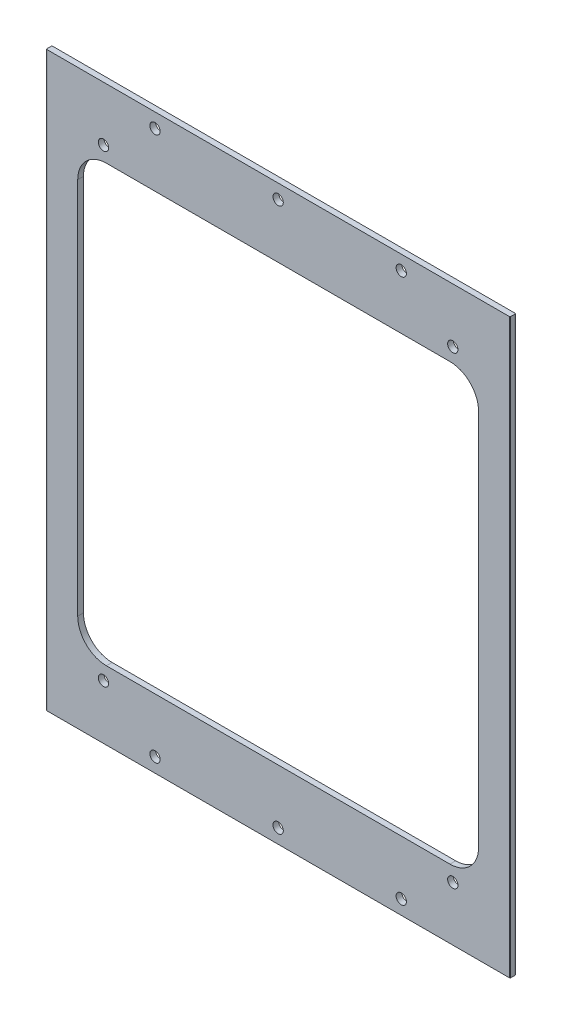
ISO-10303-21;
HEADER;
FILE_DESCRIPTION(('STEP AP214'),'2;1');
FILE_NAME('part.step','',(''),(''),'','','');
FILE_SCHEMA(('AUTOMOTIVE_DESIGN { 1 0 10303 214 1 1 1 1 }'));
ENDSEC;
DATA;
#1=APPLICATION_CONTEXT('core data for automotive mechanical design processes');
#2=APPLICATION_PROTOCOL_DEFINITION('international standard','automotive_design',2000,#1);
#3=PRODUCT_CONTEXT('',#1,'mechanical');
#4=PRODUCT('Part','Part','',(#3));
#5=PRODUCT_RELATED_PRODUCT_CATEGORY('part','',(#4));
#6=PRODUCT_DEFINITION_FORMATION('','',#4);
#7=PRODUCT_DEFINITION_CONTEXT('part definition',#1,'design');
#8=PRODUCT_DEFINITION('design','',#6,#7);
#9=PRODUCT_DEFINITION_SHAPE('','',#8);
#10=(LENGTH_UNIT() NAMED_UNIT(*) SI_UNIT(.MILLI.,.METRE.));
#11=(NAMED_UNIT(*) PLANE_ANGLE_UNIT() SI_UNIT($,.RADIAN.));
#12=(NAMED_UNIT(*) SI_UNIT($,.STERADIAN.) SOLID_ANGLE_UNIT());
#13=UNCERTAINTY_MEASURE_WITH_UNIT(LENGTH_MEASURE(1.E-05),#10,'distance_accuracy_value','');
#14=(GEOMETRIC_REPRESENTATION_CONTEXT(3) GLOBAL_UNCERTAINTY_ASSIGNED_CONTEXT((#13)) GLOBAL_UNIT_ASSIGNED_CONTEXT((#10,
#11,#12)) REPRESENTATION_CONTEXT('',''));
#15=CARTESIAN_POINT('',(0.,0.,0.));
#16=DIRECTION('',(0.,0.,1.));
#17=DIRECTION('',(1.,0.,0.));
#18=AXIS2_PLACEMENT_3D('',#15,#16,#17);
#19=CARTESIAN_POINT('',(40.5,-50.,0.5));
#20=DIRECTION('',(-1.,0.,0.));
#21=DIRECTION('',(0.,0.,1.));
#22=AXIS2_PLACEMENT_3D('',#19,#20,#21);
#23=PLANE('',#22);
#24=DIRECTION('',(0.,0.,-1.));
#25=VECTOR('',#24,1.);
#26=CARTESIAN_POINT('',(40.5,-50.,0.5));
#27=LINE('',#26,#25);
#28=CARTESIAN_POINT('',(40.5,-50.,0.4));
#29=VERTEX_POINT('',#28);
#30=CARTESIAN_POINT('',(40.5,-50.,-0.4));
#31=VERTEX_POINT('',#30);
#32=EDGE_CURVE('E233',#29,#31,#27,.T.);
#33=ORIENTED_EDGE('',*,*,#32,.T.);
#34=DIRECTION('',(0.,1.,0.));
#35=VECTOR('',#34,1.);
#36=CARTESIAN_POINT('',(40.5,50.,-0.4));
#37=LINE('',#36,#35);
#38=CARTESIAN_POINT('',(40.5,50.,-0.4));
#39=VERTEX_POINT('',#38);
#40=EDGE_CURVE('E288',#31,#39,#37,.T.);
#41=ORIENTED_EDGE('',*,*,#40,.T.);
#42=DIRECTION('',(0.,0.,-1.));
#43=VECTOR('',#42,1.);
#44=CARTESIAN_POINT('',(40.5,50.,0.5));
#45=LINE('',#44,#43);
#46=CARTESIAN_POINT('',(40.5,50.,0.4));
#47=VERTEX_POINT('',#46);
#48=EDGE_CURVE('E245',#47,#39,#45,.T.);
#49=ORIENTED_EDGE('',*,*,#48,.F.);
#50=DIRECTION('',(0.,1.,0.));
#51=VECTOR('',#50,1.);
#52=CARTESIAN_POINT('',(40.5,-50.,0.4));
#53=LINE('',#52,#51);
#54=EDGE_CURVE('E248',#47,#29,#53,.F.);
#55=ORIENTED_EDGE('',*,*,#54,.T.);
#56=EDGE_LOOP('',(#33,#41,#49,#55));
#57=FACE_BOUND('',#56,.T.);
#58=ADVANCED_FACE('F32',(#57),#23,.F.);
#59=CARTESIAN_POINT('',(-40.5,50.,0.5));
#60=DIRECTION('',(0.,-1.,0.));
#61=DIRECTION('',(0.,0.,-1.));
#62=AXIS2_PLACEMENT_3D('',#59,#60,#61);
#63=PLANE('',#62);
#64=ORIENTED_EDGE('',*,*,#48,.T.);
#65=CARTESIAN_POINT('',(40.4,50.,-0.4));
#66=DIRECTION('',(0.,-1.,0.));
#67=DIRECTION('',(0.,0.,-1.));
#68=AXIS2_PLACEMENT_3D('',#65,#66,#67);
#69=CIRCLE('',#68,0.1);
#70=CARTESIAN_POINT('',(40.4,50.,-0.5));
#71=VERTEX_POINT('',#70);
#72=EDGE_CURVE('E297',#39,#71,#69,.F.);
#73=ORIENTED_EDGE('',*,*,#72,.T.);
#74=DIRECTION('',(-1.,0.,0.));
#75=VECTOR('',#74,1.);
#76=CARTESIAN_POINT('',(-40.5,50.,-0.5));
#77=LINE('',#76,#75);
#78=CARTESIAN_POINT('',(-40.4,50.,-0.5));
#79=VERTEX_POINT('',#78);
#80=EDGE_CURVE('E214',#71,#79,#77,.T.);
#81=ORIENTED_EDGE('',*,*,#80,.T.);
#82=CARTESIAN_POINT('',(-40.4,50.,-0.4));
#83=DIRECTION('',(0.,-1.,0.));
#84=DIRECTION('',(0.,0.,-1.));
#85=AXIS2_PLACEMENT_3D('',#82,#83,#84);
#86=CIRCLE('',#85,0.1);
#87=CARTESIAN_POINT('',(-40.5,50.,-0.4));
#88=VERTEX_POINT('',#87);
#89=EDGE_CURVE('E293',#79,#88,#86,.F.);
#90=ORIENTED_EDGE('',*,*,#89,.T.);
#91=DIRECTION('',(0.,0.,-1.));
#92=VECTOR('',#91,1.);
#93=CARTESIAN_POINT('',(-40.5,50.,0.5));
#94=LINE('',#93,#92);
#95=CARTESIAN_POINT('',(-40.5,50.,0.4));
#96=VERTEX_POINT('',#95);
#97=EDGE_CURVE('E242',#96,#88,#94,.T.);
#98=ORIENTED_EDGE('',*,*,#97,.F.);
#99=CARTESIAN_POINT('',(-40.4,50.,0.4));
#100=DIRECTION('',(0.,-1.,0.));
#101=DIRECTION('',(0.,0.,-1.));
#102=AXIS2_PLACEMENT_3D('',#99,#100,#101);
#103=CIRCLE('',#102,0.1);
#104=CARTESIAN_POINT('',(-40.4,50.,0.5));
#105=VERTEX_POINT('',#104);
#106=EDGE_CURVE('E291',#96,#105,#103,.F.);
#107=ORIENTED_EDGE('',*,*,#106,.T.);
#108=DIRECTION('',(-1.,0.,0.));
#109=VECTOR('',#108,1.);
#110=CARTESIAN_POINT('',(-40.5,50.,0.5));
#111=LINE('',#110,#109);
#112=CARTESIAN_POINT('',(40.4,50.,0.5));
#113=VERTEX_POINT('',#112);
#114=EDGE_CURVE('E226',#113,#105,#111,.T.);
#115=ORIENTED_EDGE('',*,*,#114,.F.);
#116=CARTESIAN_POINT('',(40.4,50.,0.4));
#117=DIRECTION('',(0.,-1.,0.));
#118=DIRECTION('',(0.,0.,-1.));
#119=AXIS2_PLACEMENT_3D('',#116,#117,#118);
#120=CIRCLE('',#119,0.1);
#121=EDGE_CURVE('E295',#113,#47,#120,.F.);
#122=ORIENTED_EDGE('',*,*,#121,.T.);
#123=EDGE_LOOP('',(#64,#73,#81,#90,#98,#107,#115,#122));
#124=FACE_BOUND('',#123,.T.);
#125=ADVANCED_FACE('F321',(#124),#63,.F.);
#126=CARTESIAN_POINT('',(-40.5,-50.,0.5));
#127=DIRECTION('',(1.,0.,0.));
#128=DIRECTION('',(0.,0.,-1.));
#129=AXIS2_PLACEMENT_3D('',#126,#127,#128);
#130=PLANE('',#129);
#131=ORIENTED_EDGE('',*,*,#97,.T.);
#132=DIRECTION('',(0.,-1.,0.));
#133=VECTOR('',#132,1.);
#134=CARTESIAN_POINT('',(-40.5,-50.,-0.4));
#135=LINE('',#134,#133);
#136=CARTESIAN_POINT('',(-40.5,-50.,-0.4));
#137=VERTEX_POINT('',#136);
#138=EDGE_CURVE('E11',#88,#137,#135,.T.);
#139=ORIENTED_EDGE('',*,*,#138,.T.);
#140=DIRECTION('',(0.,0.,-1.));
#141=VECTOR('',#140,1.);
#142=CARTESIAN_POINT('',(-40.5,-50.,0.5));
#143=LINE('',#142,#141);
#144=CARTESIAN_POINT('',(-40.5,-50.,0.4));
#145=VERTEX_POINT('',#144);
#146=EDGE_CURVE('E240',#145,#137,#143,.T.);
#147=ORIENTED_EDGE('',*,*,#146,.F.);
#148=DIRECTION('',(0.,-1.,0.));
#149=VECTOR('',#148,1.);
#150=CARTESIAN_POINT('',(-40.5,-50.,0.4));
#151=LINE('',#150,#149);
#152=EDGE_CURVE('E40',#145,#96,#151,.F.);
#153=ORIENTED_EDGE('',*,*,#152,.T.);
#154=EDGE_LOOP('',(#131,#139,#147,#153));
#155=FACE_BOUND('',#154,.T.);
#156=ADVANCED_FACE('F317',(#155),#130,.F.);
#157=CARTESIAN_POINT('',(-40.5,-50.,0.5));
#158=DIRECTION('',(0.,1.,0.));
#159=DIRECTION('',(0.,0.,1.));
#160=AXIS2_PLACEMENT_3D('',#157,#158,#159);
#161=PLANE('',#160);
#162=DIRECTION('',(1.,0.,0.));
#163=VECTOR('',#162,1.);
#164=CARTESIAN_POINT('',(-40.5,-50.,-0.5));
#165=LINE('',#164,#163);
#166=CARTESIAN_POINT('',(-40.4,-50.,-0.5));
#167=VERTEX_POINT('',#166);
#168=CARTESIAN_POINT('',(40.4,-50.,-0.5));
#169=VERTEX_POINT('',#168);
#170=EDGE_CURVE('E230',#167,#169,#165,.T.);
#171=ORIENTED_EDGE('',*,*,#170,.T.);
#172=CARTESIAN_POINT('',(40.4,-50.,-0.4));
#173=DIRECTION('',(0.,1.,0.));
#174=DIRECTION('',(0.,0.,1.));
#175=AXIS2_PLACEMENT_3D('',#172,#173,#174);
#176=CIRCLE('',#175,0.1);
#177=EDGE_CURVE('E307',#169,#31,#176,.F.);
#178=ORIENTED_EDGE('',*,*,#177,.T.);
#179=ORIENTED_EDGE('',*,*,#32,.F.);
#180=CARTESIAN_POINT('',(40.4,-50.,0.4));
#181=DIRECTION('',(0.,1.,0.));
#182=DIRECTION('',(0.,0.,1.));
#183=AXIS2_PLACEMENT_3D('',#180,#181,#182);
#184=CIRCLE('',#183,0.1);
#185=CARTESIAN_POINT('',(40.4,-50.,0.5));
#186=VERTEX_POINT('',#185);
#187=EDGE_CURVE('E305',#29,#186,#184,.F.);
#188=ORIENTED_EDGE('',*,*,#187,.T.);
#189=DIRECTION('',(1.,0.,0.));
#190=VECTOR('',#189,1.);
#191=CARTESIAN_POINT('',(-40.5,-50.,0.5));
#192=LINE('',#191,#190);
#193=CARTESIAN_POINT('',(-40.4,-50.,0.5));
#194=VERTEX_POINT('',#193);
#195=EDGE_CURVE('E229',#194,#186,#192,.T.);
#196=ORIENTED_EDGE('',*,*,#195,.F.);
#197=CARTESIAN_POINT('',(-40.4,-50.,0.4));
#198=DIRECTION('',(0.,1.,0.));
#199=DIRECTION('',(0.,0.,1.));
#200=AXIS2_PLACEMENT_3D('',#197,#198,#199);
#201=CIRCLE('',#200,0.1);
#202=EDGE_CURVE('E54',#194,#145,#201,.F.);
#203=ORIENTED_EDGE('',*,*,#202,.T.);
#204=ORIENTED_EDGE('',*,*,#146,.T.);
#205=CARTESIAN_POINT('',(-40.4,-50.,-0.4));
#206=DIRECTION('',(0.,1.,0.));
#207=DIRECTION('',(0.,0.,1.));
#208=AXIS2_PLACEMENT_3D('',#205,#206,#207);
#209=CIRCLE('',#208,0.1);
#210=EDGE_CURVE('E47',#137,#167,#209,.F.);
#211=ORIENTED_EDGE('',*,*,#210,.T.);
#212=EDGE_LOOP('',(#171,#178,#179,#188,#196,#203,#204,#211));
#213=FACE_BOUND('',#212,.T.);
#214=ADVANCED_FACE('F328',(#213),#161,.F.);
#215=CARTESIAN_POINT('',(0.,0.,0.5));
#216=DIRECTION('',(0.,0.,-1.));
#217=DIRECTION('',(-1.,0.,0.));
#218=AXIS2_PLACEMENT_3D('',#215,#216,#217);
#219=PLANE('',#218);
#220=CARTESIAN_POINT('',(0.,47.5,0.500000000000001));
#221=DIRECTION('',(0.,0.,1.));
#222=DIRECTION('',(1.,0.,0.));
#223=AXIS2_PLACEMENT_3D('',#220,#221,#222);
#224=CIRCLE('',#223,0.899999999999989);
#225=CARTESIAN_POINT('',(0.899999999999989,47.5,0.500000000000001));
#226=VERTEX_POINT('',#225);
#227=EDGE_CURVE('E286',#226,#226,#224,.T.);
#228=ORIENTED_EDGE('',*,*,#227,.F.);
#229=EDGE_LOOP('',(#228));
#230=FACE_BOUND('',#229,.T.);
#231=CARTESIAN_POINT('',(0.,-47.5,0.500000000000001));
#232=DIRECTION('',(0.,0.,1.));
#233=DIRECTION('',(1.,0.,0.));
#234=AXIS2_PLACEMENT_3D('',#231,#232,#233);
#235=CIRCLE('',#234,0.899999999999989);
#236=CARTESIAN_POINT('',(0.899999999999989,-47.5,0.500000000000001));
#237=VERTEX_POINT('',#236);
#238=EDGE_CURVE('E282',#237,#237,#235,.T.);
#239=ORIENTED_EDGE('',*,*,#238,.F.);
#240=EDGE_LOOP('',(#239));
#241=FACE_BOUND('',#240,.T.);
#242=CARTESIAN_POINT('',(-21.5,47.5,0.500000000000001));
#243=DIRECTION('',(0.,0.,1.));
#244=DIRECTION('',(1.,0.,0.));
#245=AXIS2_PLACEMENT_3D('',#242,#243,#244);
#246=CIRCLE('',#245,0.899999999999988);
#247=CARTESIAN_POINT('',(-20.6,47.5,0.500000000000001));
#248=VERTEX_POINT('',#247);
#249=EDGE_CURVE('E278',#248,#248,#246,.T.);
#250=ORIENTED_EDGE('',*,*,#249,.F.);
#251=EDGE_LOOP('',(#250));
#252=FACE_BOUND('',#251,.T.);
#253=CARTESIAN_POINT('',(21.5,47.5,0.500000000000001));
#254=DIRECTION('',(0.,0.,1.));
#255=DIRECTION('',(1.,0.,0.));
#256=AXIS2_PLACEMENT_3D('',#253,#254,#255);
#257=CIRCLE('',#256,0.899999999999988);
#258=CARTESIAN_POINT('',(22.4,47.5,0.500000000000001));
#259=VERTEX_POINT('',#258);
#260=EDGE_CURVE('E274',#259,#259,#257,.T.);
#261=ORIENTED_EDGE('',*,*,#260,.F.);
#262=EDGE_LOOP('',(#261));
#263=FACE_BOUND('',#262,.T.);
#264=CARTESIAN_POINT('',(-21.5,-47.5,0.500000000000001));
#265=DIRECTION('',(0.,0.,1.));
#266=DIRECTION('',(1.,0.,0.));
#267=AXIS2_PLACEMENT_3D('',#264,#265,#266);
#268=CIRCLE('',#267,0.899999999999991);
#269=CARTESIAN_POINT('',(-20.6,-47.5,0.500000000000001));
#270=VERTEX_POINT('',#269);
#271=EDGE_CURVE('E270',#270,#270,#268,.T.);
#272=ORIENTED_EDGE('',*,*,#271,.F.);
#273=EDGE_LOOP('',(#272));
#274=FACE_BOUND('',#273,.T.);
#275=CARTESIAN_POINT('',(21.5,-47.5,0.500000000000001));
#276=DIRECTION('',(0.,0.,1.));
#277=DIRECTION('',(1.,0.,0.));
#278=AXIS2_PLACEMENT_3D('',#275,#276,#277);
#279=CIRCLE('',#278,0.899999999999988);
#280=CARTESIAN_POINT('',(22.4,-47.5,0.500000000000001));
#281=VERTEX_POINT('',#280);
#282=EDGE_CURVE('E266',#281,#281,#279,.T.);
#283=ORIENTED_EDGE('',*,*,#282,.F.);
#284=EDGE_LOOP('',(#283));
#285=FACE_BOUND('',#284,.T.);
#286=CARTESIAN_POINT('',(-30.5,40.5,0.500000000000001));
#287=DIRECTION('',(0.,0.,1.));
#288=DIRECTION('',(1.,0.,0.));
#289=AXIS2_PLACEMENT_3D('',#286,#287,#288);
#290=CIRCLE('',#289,0.899999999999991);
#291=CARTESIAN_POINT('',(-29.6,40.5,0.500000000000001));
#292=VERTEX_POINT('',#291);
#293=EDGE_CURVE('E262',#292,#292,#290,.T.);
#294=ORIENTED_EDGE('',*,*,#293,.F.);
#295=EDGE_LOOP('',(#294));
#296=FACE_BOUND('',#295,.T.);
#297=CARTESIAN_POINT('',(30.5,40.5,0.500000000000001));
#298=DIRECTION('',(0.,0.,1.));
#299=DIRECTION('',(1.,0.,0.));
#300=AXIS2_PLACEMENT_3D('',#297,#298,#299);
#301=CIRCLE('',#300,0.899999999999991);
#302=CARTESIAN_POINT('',(31.4,40.5,0.500000000000001));
#303=VERTEX_POINT('',#302);
#304=EDGE_CURVE('E258',#303,#303,#301,.T.);
#305=ORIENTED_EDGE('',*,*,#304,.F.);
#306=EDGE_LOOP('',(#305));
#307=FACE_BOUND('',#306,.T.);
#308=CARTESIAN_POINT('',(-30.5,-40.5,0.500000000000001));
#309=DIRECTION('',(0.,0.,1.));
#310=DIRECTION('',(1.,0.,0.));
#311=AXIS2_PLACEMENT_3D('',#308,#309,#310);
#312=CIRCLE('',#311,0.899999999999991);
#313=CARTESIAN_POINT('',(-29.6,-40.5,0.500000000000001));
#314=VERTEX_POINT('',#313);
#315=EDGE_CURVE('E254',#314,#314,#312,.T.);
#316=ORIENTED_EDGE('',*,*,#315,.F.);
#317=EDGE_LOOP('',(#316));
#318=FACE_BOUND('',#317,.T.);
#319=CARTESIAN_POINT('',(30.5,-40.5,0.500000000000001));
#320=DIRECTION('',(0.,0.,1.));
#321=DIRECTION('',(1.,0.,0.));
#322=AXIS2_PLACEMENT_3D('',#319,#320,#321);
#323=CIRCLE('',#322,0.899999999999991);
#324=CARTESIAN_POINT('',(31.4,-40.5,0.500000000000001));
#325=VERTEX_POINT('',#324);
#326=EDGE_CURVE('E178',#325,#325,#323,.T.);
#327=ORIENTED_EDGE('',*,*,#326,.F.);
#328=EDGE_LOOP('',(#327));
#329=FACE_BOUND('',#328,.T.);
#330=DIRECTION('',(0.,-1.,0.));
#331=VECTOR('',#330,1.);
#332=CARTESIAN_POINT('',(-35.,-33.,0.5));
#333=LINE('',#332,#331);
#334=CARTESIAN_POINT('',(-35.,33.,0.5));
#335=VERTEX_POINT('',#334);
#336=CARTESIAN_POINT('',(-35.,-33.,0.5));
#337=VERTEX_POINT('',#336);
#338=EDGE_CURVE('E195',#335,#337,#333,.T.);
#339=ORIENTED_EDGE('',*,*,#338,.F.);
#340=CARTESIAN_POINT('',(-30.,33.,0.5));
#341=DIRECTION('',(0.,0.,1.));
#342=DIRECTION('',(-1.,0.,0.));
#343=AXIS2_PLACEMENT_3D('',#340,#341,#342);
#344=CIRCLE('',#343,4.99999999999999);
#345=CARTESIAN_POINT('',(-30.,38.,0.5));
#346=VERTEX_POINT('',#345);
#347=EDGE_CURVE('E153',#346,#335,#344,.T.);
#348=ORIENTED_EDGE('',*,*,#347,.F.);
#349=DIRECTION('',(-1.,0.,0.));
#350=VECTOR('',#349,1.);
#351=CARTESIAN_POINT('',(-30.,38.,0.5));
#352=LINE('',#351,#350);
#353=CARTESIAN_POINT('',(30.,38.,0.5));
#354=VERTEX_POINT('',#353);
#355=EDGE_CURVE('E172',#354,#346,#352,.T.);
#356=ORIENTED_EDGE('',*,*,#355,.F.);
#357=CARTESIAN_POINT('',(30.,33.,0.5));
#358=DIRECTION('',(0.,0.,1.));
#359=DIRECTION('',(-1.,0.,0.));
#360=AXIS2_PLACEMENT_3D('',#357,#358,#359);
#361=CIRCLE('',#360,5.);
#362=CARTESIAN_POINT('',(35.,33.,0.5));
#363=VERTEX_POINT('',#362);
#364=EDGE_CURVE('E175',#363,#354,#361,.T.);
#365=ORIENTED_EDGE('',*,*,#364,.F.);
#366=DIRECTION('',(0.,1.,0.));
#367=VECTOR('',#366,1.);
#368=CARTESIAN_POINT('',(35.,-33.,0.5));
#369=LINE('',#368,#367);
#370=CARTESIAN_POINT('',(35.,-33.,0.5));
#371=VERTEX_POINT('',#370);
#372=EDGE_CURVE('E207',#371,#363,#369,.T.);
#373=ORIENTED_EDGE('',*,*,#372,.F.);
#374=CARTESIAN_POINT('',(30.,-33.,0.5));
#375=DIRECTION('',(0.,0.,1.));
#376=DIRECTION('',(-1.,0.,0.));
#377=AXIS2_PLACEMENT_3D('',#374,#375,#376);
#378=CIRCLE('',#377,5.);
#379=CARTESIAN_POINT('',(30.,-38.,0.5));
#380=VERTEX_POINT('',#379);
#381=EDGE_CURVE('E204',#380,#371,#378,.T.);
#382=ORIENTED_EDGE('',*,*,#381,.F.);
#383=DIRECTION('',(1.,0.,0.));
#384=VECTOR('',#383,1.);
#385=CARTESIAN_POINT('',(-30.,-38.,0.5));
#386=LINE('',#385,#384);
#387=CARTESIAN_POINT('',(-30.,-38.,0.5));
#388=VERTEX_POINT('',#387);
#389=EDGE_CURVE('E201',#388,#380,#386,.T.);
#390=ORIENTED_EDGE('',*,*,#389,.F.);
#391=CARTESIAN_POINT('',(-30.,-33.,0.5));
#392=DIRECTION('',(0.,0.,1.));
#393=DIRECTION('',(-1.,0.,0.));
#394=AXIS2_PLACEMENT_3D('',#391,#392,#393);
#395=CIRCLE('',#394,5.);
#396=EDGE_CURVE('E198',#337,#388,#395,.T.);
#397=ORIENTED_EDGE('',*,*,#396,.F.);
#398=EDGE_LOOP('',(#339,#348,#356,#365,#373,#382,#390,#397));
#399=FACE_BOUND('',#398,.T.);
#400=ORIENTED_EDGE('',*,*,#195,.T.);
#401=DIRECTION('',(0.,1.,0.));
#402=VECTOR('',#401,1.);
#403=CARTESIAN_POINT('',(40.4,0.,0.5));
#404=LINE('',#403,#402);
#405=EDGE_CURVE('E312',#186,#113,#404,.T.);
#406=ORIENTED_EDGE('',*,*,#405,.T.);
#407=ORIENTED_EDGE('',*,*,#114,.T.);
#408=DIRECTION('',(0.,-1.,0.));
#409=VECTOR('',#408,1.);
#410=CARTESIAN_POINT('',(-40.4,0.,0.5));
#411=LINE('',#410,#409);
#412=EDGE_CURVE('E309',#105,#194,#411,.T.);
#413=ORIENTED_EDGE('',*,*,#412,.T.);
#414=EDGE_LOOP('',(#400,#406,#407,#413));
#415=FACE_BOUND('',#414,.T.);
#416=ADVANCED_FACE('F326',(#230,#241,#252,#263,#274,#285,#296,#307,#318,#329,#399,#415),#219,.F.);
#417=CARTESIAN_POINT('',(0.,0.,-0.5));
#418=DIRECTION('',(0.,0.,-1.));
#419=DIRECTION('',(-1.,0.,0.));
#420=AXIS2_PLACEMENT_3D('',#417,#418,#419);
#421=PLANE('',#420);
#422=CARTESIAN_POINT('',(0.,47.5,-0.5));
#423=DIRECTION('',(0.,0.,-1.));
#424=DIRECTION('',(-1.,0.,0.));
#425=AXIS2_PLACEMENT_3D('',#422,#423,#424);
#426=CIRCLE('',#425,0.899999999999977);
#427=CARTESIAN_POINT('',(-0.899999999999977,47.5,-0.5));
#428=VERTEX_POINT('',#427);
#429=EDGE_CURVE('E283',#428,#428,#426,.T.);
#430=ORIENTED_EDGE('',*,*,#429,.F.);
#431=EDGE_LOOP('',(#430));
#432=FACE_BOUND('',#431,.T.);
#433=CARTESIAN_POINT('',(0.,-47.5,-0.5));
#434=DIRECTION('',(0.,0.,-1.));
#435=DIRECTION('',(-1.,0.,0.));
#436=AXIS2_PLACEMENT_3D('',#433,#434,#435);
#437=CIRCLE('',#436,0.899999999999977);
#438=CARTESIAN_POINT('',(-0.899999999999977,-47.5,-0.5));
#439=VERTEX_POINT('',#438);
#440=EDGE_CURVE('E279',#439,#439,#437,.T.);
#441=ORIENTED_EDGE('',*,*,#440,.F.);
#442=EDGE_LOOP('',(#441));
#443=FACE_BOUND('',#442,.T.);
#444=CARTESIAN_POINT('',(-21.5,47.5,-0.5));
#445=DIRECTION('',(0.,0.,-1.));
#446=DIRECTION('',(-1.,0.,0.));
#447=AXIS2_PLACEMENT_3D('',#444,#445,#446);
#448=CIRCLE('',#447,0.899999999999982);
#449=CARTESIAN_POINT('',(-22.4,47.5,-0.5));
#450=VERTEX_POINT('',#449);
#451=EDGE_CURVE('E275',#450,#450,#448,.T.);
#452=ORIENTED_EDGE('',*,*,#451,.F.);
#453=EDGE_LOOP('',(#452));
#454=FACE_BOUND('',#453,.T.);
#455=CARTESIAN_POINT('',(21.5,47.5,-0.5));
#456=DIRECTION('',(0.,0.,-1.));
#457=DIRECTION('',(-1.,0.,0.));
#458=AXIS2_PLACEMENT_3D('',#455,#456,#457);
#459=CIRCLE('',#458,0.899999999999982);
#460=CARTESIAN_POINT('',(20.6,47.5,-0.5));
#461=VERTEX_POINT('',#460);
#462=EDGE_CURVE('E271',#461,#461,#459,.T.);
#463=ORIENTED_EDGE('',*,*,#462,.F.);
#464=EDGE_LOOP('',(#463));
#465=FACE_BOUND('',#464,.T.);
#466=CARTESIAN_POINT('',(-21.5,-47.5,-0.5));
#467=DIRECTION('',(0.,0.,-1.));
#468=DIRECTION('',(-1.,0.,0.));
#469=AXIS2_PLACEMENT_3D('',#466,#467,#468);
#470=CIRCLE('',#469,0.899999999999984);
#471=CARTESIAN_POINT('',(-22.4,-47.5,-0.5));
#472=VERTEX_POINT('',#471);
#473=EDGE_CURVE('E267',#472,#472,#470,.T.);
#474=ORIENTED_EDGE('',*,*,#473,.F.);
#475=EDGE_LOOP('',(#474));
#476=FACE_BOUND('',#475,.T.);
#477=CARTESIAN_POINT('',(21.5,-47.5,-0.5));
#478=DIRECTION('',(0.,0.,-1.));
#479=DIRECTION('',(-1.,0.,0.));
#480=AXIS2_PLACEMENT_3D('',#477,#478,#479);
#481=CIRCLE('',#480,0.899999999999982);
#482=CARTESIAN_POINT('',(20.6,-47.5,-0.5));
#483=VERTEX_POINT('',#482);
#484=EDGE_CURVE('E263',#483,#483,#481,.T.);
#485=ORIENTED_EDGE('',*,*,#484,.F.);
#486=EDGE_LOOP('',(#485));
#487=FACE_BOUND('',#486,.T.);
#488=CARTESIAN_POINT('',(-30.5,40.5,-0.5));
#489=DIRECTION('',(0.,0.,-1.));
#490=DIRECTION('',(-1.,0.,0.));
#491=AXIS2_PLACEMENT_3D('',#488,#489,#490);
#492=CIRCLE('',#491,0.899999999999984);
#493=CARTESIAN_POINT('',(-31.4,40.5,-0.5));
#494=VERTEX_POINT('',#493);
#495=EDGE_CURVE('E259',#494,#494,#492,.T.);
#496=ORIENTED_EDGE('',*,*,#495,.F.);
#497=EDGE_LOOP('',(#496));
#498=FACE_BOUND('',#497,.T.);
#499=CARTESIAN_POINT('',(30.5,40.5,-0.5));
#500=DIRECTION('',(0.,0.,-1.));
#501=DIRECTION('',(-1.,0.,0.));
#502=AXIS2_PLACEMENT_3D('',#499,#500,#501);
#503=CIRCLE('',#502,0.899999999999984);
#504=CARTESIAN_POINT('',(29.6,40.5,-0.5));
#505=VERTEX_POINT('',#504);
#506=EDGE_CURVE('E255',#505,#505,#503,.T.);
#507=ORIENTED_EDGE('',*,*,#506,.F.);
#508=EDGE_LOOP('',(#507));
#509=FACE_BOUND('',#508,.T.);
#510=CARTESIAN_POINT('',(-30.5,-40.5,-0.5));
#511=DIRECTION('',(0.,0.,-1.));
#512=DIRECTION('',(-1.,0.,0.));
#513=AXIS2_PLACEMENT_3D('',#510,#511,#512);
#514=CIRCLE('',#513,0.899999999999984);
#515=CARTESIAN_POINT('',(-31.4,-40.5,-0.5));
#516=VERTEX_POINT('',#515);
#517=EDGE_CURVE('E251',#516,#516,#514,.T.);
#518=ORIENTED_EDGE('',*,*,#517,.F.);
#519=EDGE_LOOP('',(#518));
#520=FACE_BOUND('',#519,.T.);
#521=CARTESIAN_POINT('',(30.5,-40.5,-0.5));
#522=DIRECTION('',(0.,0.,-1.));
#523=DIRECTION('',(-1.,0.,0.));
#524=AXIS2_PLACEMENT_3D('',#521,#522,#523);
#525=CIRCLE('',#524,0.899999999999984);
#526=CARTESIAN_POINT('',(29.6,-40.5,-0.5));
#527=VERTEX_POINT('',#526);
#528=EDGE_CURVE('E196',#527,#527,#525,.T.);
#529=ORIENTED_EDGE('',*,*,#528,.F.);
#530=EDGE_LOOP('',(#529));
#531=FACE_BOUND('',#530,.T.);
#532=CARTESIAN_POINT('',(-30.,33.,-0.5));
#533=DIRECTION('',(0.,0.,1.));
#534=DIRECTION('',(-1.,0.,0.));
#535=AXIS2_PLACEMENT_3D('',#532,#533,#534);
#536=CIRCLE('',#535,4.99999999999999);
#537=CARTESIAN_POINT('',(-30.,38.,-0.5));
#538=VERTEX_POINT('',#537);
#539=CARTESIAN_POINT('',(-35.,33.,-0.5));
#540=VERTEX_POINT('',#539);
#541=EDGE_CURVE('E150',#538,#540,#536,.T.);
#542=ORIENTED_EDGE('',*,*,#541,.T.);
#543=DIRECTION('',(0.,-1.,0.));
#544=VECTOR('',#543,1.);
#545=CARTESIAN_POINT('',(-35.,-33.,-0.5));
#546=LINE('',#545,#544);
#547=CARTESIAN_POINT('',(-35.,-33.,-0.5));
#548=VERTEX_POINT('',#547);
#549=EDGE_CURVE('E162',#540,#548,#546,.T.);
#550=ORIENTED_EDGE('',*,*,#549,.T.);
#551=CARTESIAN_POINT('',(-30.,-33.,-0.5));
#552=DIRECTION('',(0.,0.,1.));
#553=DIRECTION('',(-1.,0.,0.));
#554=AXIS2_PLACEMENT_3D('',#551,#552,#553);
#555=CIRCLE('',#554,5.);
#556=CARTESIAN_POINT('',(-30.,-38.,-0.5));
#557=VERTEX_POINT('',#556);
#558=EDGE_CURVE('E166',#548,#557,#555,.T.);
#559=ORIENTED_EDGE('',*,*,#558,.T.);
#560=DIRECTION('',(1.,0.,0.));
#561=VECTOR('',#560,1.);
#562=CARTESIAN_POINT('',(-30.,-38.,-0.5));
#563=LINE('',#562,#561);
#564=CARTESIAN_POINT('',(30.,-38.,-0.5));
#565=VERTEX_POINT('',#564);
#566=EDGE_CURVE('E182',#557,#565,#563,.T.);
#567=ORIENTED_EDGE('',*,*,#566,.T.);
#568=CARTESIAN_POINT('',(30.,-33.,-0.5));
#569=DIRECTION('',(0.,0.,1.));
#570=DIRECTION('',(-1.,0.,0.));
#571=AXIS2_PLACEMENT_3D('',#568,#569,#570);
#572=CIRCLE('',#571,5.);
#573=CARTESIAN_POINT('',(35.,-33.,-0.5));
#574=VERTEX_POINT('',#573);
#575=EDGE_CURVE('E185',#565,#574,#572,.T.);
#576=ORIENTED_EDGE('',*,*,#575,.T.);
#577=DIRECTION('',(0.,1.,0.));
#578=VECTOR('',#577,1.);
#579=CARTESIAN_POINT('',(35.,-33.,-0.5));
#580=LINE('',#579,#578);
#581=CARTESIAN_POINT('',(35.,33.,-0.5));
#582=VERTEX_POINT('',#581);
#583=EDGE_CURVE('E188',#574,#582,#580,.T.);
#584=ORIENTED_EDGE('',*,*,#583,.T.);
#585=CARTESIAN_POINT('',(30.,33.,-0.5));
#586=DIRECTION('',(0.,0.,1.));
#587=DIRECTION('',(-1.,0.,0.));
#588=AXIS2_PLACEMENT_3D('',#585,#586,#587);
#589=CIRCLE('',#588,5.);
#590=CARTESIAN_POINT('',(30.,38.,-0.5));
#591=VERTEX_POINT('',#590);
#592=EDGE_CURVE('E191',#582,#591,#589,.T.);
#593=ORIENTED_EDGE('',*,*,#592,.T.);
#594=DIRECTION('',(-1.,0.,0.));
#595=VECTOR('',#594,1.);
#596=CARTESIAN_POINT('',(-30.,38.,-0.5));
#597=LINE('',#596,#595);
#598=EDGE_CURVE('E158',#591,#538,#597,.T.);
#599=ORIENTED_EDGE('',*,*,#598,.T.);
#600=EDGE_LOOP('',(#542,#550,#559,#567,#576,#584,#593,#599));
#601=FACE_BOUND('',#600,.T.);
#602=ORIENTED_EDGE('',*,*,#80,.F.);
#603=DIRECTION('',(0.,1.,0.));
#604=VECTOR('',#603,1.);
#605=CARTESIAN_POINT('',(40.4,-50.,-0.5));
#606=LINE('',#605,#604);
#607=EDGE_CURVE('E301',#71,#169,#606,.F.);
#608=ORIENTED_EDGE('',*,*,#607,.T.);
#609=ORIENTED_EDGE('',*,*,#170,.F.);
#610=DIRECTION('',(0.,-1.,0.));
#611=VECTOR('',#610,1.);
#612=CARTESIAN_POINT('',(-40.4,50.,-0.5));
#613=LINE('',#612,#611);
#614=EDGE_CURVE('E299',#167,#79,#613,.F.);
#615=ORIENTED_EDGE('',*,*,#614,.T.);
#616=EDGE_LOOP('',(#602,#608,#609,#615));
#617=FACE_BOUND('',#616,.T.);
#618=ADVANCED_FACE('F168',(#432,#443,#454,#465,#476,#487,#498,#509,#520,#531,#601,#617),#421,.T.);
#619=CARTESIAN_POINT('',(-30.,33.,-0.5));
#620=DIRECTION('',(0.,0.,1.));
#621=DIRECTION('',(1.,0.,0.));
#622=AXIS2_PLACEMENT_3D('',#619,#620,#621);
#623=CYLINDRICAL_SURFACE('',#622,4.99999999999999);
#624=ORIENTED_EDGE('',*,*,#347,.T.);
#625=DIRECTION('',(0.,0.,1.));
#626=VECTOR('',#625,1.);
#627=CARTESIAN_POINT('',(-35.,33.,-0.5));
#628=LINE('',#627,#626);
#629=EDGE_CURVE('E146',#540,#335,#628,.T.);
#630=ORIENTED_EDGE('',*,*,#629,.F.);
#631=ORIENTED_EDGE('',*,*,#541,.F.);
#632=DIRECTION('',(0.,0.,1.));
#633=VECTOR('',#632,1.);
#634=CARTESIAN_POINT('',(-30.,38.,-0.5));
#635=LINE('',#634,#633);
#636=EDGE_CURVE('E212',#538,#346,#635,.T.);
#637=ORIENTED_EDGE('',*,*,#636,.T.);
#638=EDGE_LOOP('',(#624,#630,#631,#637));
#639=FACE_BOUND('',#638,.T.);
#640=ADVANCED_FACE('F148',(#639),#623,.F.);
#641=CARTESIAN_POINT('',(-30.,38.,-0.5));
#642=DIRECTION('',(0.,1.,0.));
#643=DIRECTION('',(0.,0.,1.));
#644=AXIS2_PLACEMENT_3D('',#641,#642,#643);
#645=PLANE('',#644);
#646=ORIENTED_EDGE('',*,*,#355,.T.);
#647=ORIENTED_EDGE('',*,*,#636,.F.);
#648=ORIENTED_EDGE('',*,*,#598,.F.);
#649=DIRECTION('',(0.,0.,1.));
#650=VECTOR('',#649,1.);
#651=CARTESIAN_POINT('',(30.,38.,-0.5));
#652=LINE('',#651,#650);
#653=EDGE_CURVE('E215',#591,#354,#652,.T.);
#654=ORIENTED_EDGE('',*,*,#653,.T.);
#655=EDGE_LOOP('',(#646,#647,#648,#654));
#656=FACE_BOUND('',#655,.T.);
#657=ADVANCED_FACE('F405',(#656),#645,.F.);
#658=CARTESIAN_POINT('',(30.,33.,-0.5));
#659=DIRECTION('',(0.,0.,1.));
#660=DIRECTION('',(1.,0.,0.));
#661=AXIS2_PLACEMENT_3D('',#658,#659,#660);
#662=CYLINDRICAL_SURFACE('',#661,5.);
#663=ORIENTED_EDGE('',*,*,#364,.T.);
#664=ORIENTED_EDGE('',*,*,#653,.F.);
#665=ORIENTED_EDGE('',*,*,#592,.F.);
#666=DIRECTION('',(0.,0.,1.));
#667=VECTOR('',#666,1.);
#668=CARTESIAN_POINT('',(35.,33.,-0.5));
#669=LINE('',#668,#667);
#670=EDGE_CURVE('E217',#582,#363,#669,.T.);
#671=ORIENTED_EDGE('',*,*,#670,.T.);
#672=EDGE_LOOP('',(#663,#664,#665,#671));
#673=FACE_BOUND('',#672,.T.);
#674=ADVANCED_FACE('F408',(#673),#662,.F.);
#675=CARTESIAN_POINT('',(35.,-33.,-0.5));
#676=DIRECTION('',(1.,0.,0.));
#677=DIRECTION('',(0.,0.,-1.));
#678=AXIS2_PLACEMENT_3D('',#675,#676,#677);
#679=PLANE('',#678);
#680=ORIENTED_EDGE('',*,*,#372,.T.);
#681=ORIENTED_EDGE('',*,*,#670,.F.);
#682=ORIENTED_EDGE('',*,*,#583,.F.);
#683=DIRECTION('',(0.,0.,1.));
#684=VECTOR('',#683,1.);
#685=CARTESIAN_POINT('',(35.,-33.,-0.5));
#686=LINE('',#685,#684);
#687=EDGE_CURVE('E219',#574,#371,#686,.T.);
#688=ORIENTED_EDGE('',*,*,#687,.T.);
#689=EDGE_LOOP('',(#680,#681,#682,#688));
#690=FACE_BOUND('',#689,.T.);
#691=ADVANCED_FACE('F412',(#690),#679,.F.);
#692=CARTESIAN_POINT('',(30.,-33.,-0.5));
#693=DIRECTION('',(0.,0.,1.));
#694=DIRECTION('',(1.,0.,0.));
#695=AXIS2_PLACEMENT_3D('',#692,#693,#694);
#696=CYLINDRICAL_SURFACE('',#695,5.);
#697=ORIENTED_EDGE('',*,*,#381,.T.);
#698=ORIENTED_EDGE('',*,*,#687,.F.);
#699=ORIENTED_EDGE('',*,*,#575,.F.);
#700=DIRECTION('',(0.,0.,1.));
#701=VECTOR('',#700,1.);
#702=CARTESIAN_POINT('',(30.,-38.,-0.5));
#703=LINE('',#702,#701);
#704=EDGE_CURVE('E221',#565,#380,#703,.T.);
#705=ORIENTED_EDGE('',*,*,#704,.T.);
#706=EDGE_LOOP('',(#697,#698,#699,#705));
#707=FACE_BOUND('',#706,.T.);
#708=ADVANCED_FACE('F416',(#707),#696,.F.);
#709=CARTESIAN_POINT('',(-30.,-38.,-0.5));
#710=DIRECTION('',(0.,-1.,0.));
#711=DIRECTION('',(0.,0.,-1.));
#712=AXIS2_PLACEMENT_3D('',#709,#710,#711);
#713=PLANE('',#712);
#714=ORIENTED_EDGE('',*,*,#389,.T.);
#715=ORIENTED_EDGE('',*,*,#704,.F.);
#716=ORIENTED_EDGE('',*,*,#566,.F.);
#717=DIRECTION('',(0.,0.,1.));
#718=VECTOR('',#717,1.);
#719=CARTESIAN_POINT('',(-30.,-38.,-0.5));
#720=LINE('',#719,#718);
#721=EDGE_CURVE('E223',#557,#388,#720,.T.);
#722=ORIENTED_EDGE('',*,*,#721,.T.);
#723=EDGE_LOOP('',(#714,#715,#716,#722));
#724=FACE_BOUND('',#723,.T.);
#725=ADVANCED_FACE('F420',(#724),#713,.F.);
#726=CARTESIAN_POINT('',(-30.,-33.,-0.5));
#727=DIRECTION('',(0.,0.,1.));
#728=DIRECTION('',(1.,0.,0.));
#729=AXIS2_PLACEMENT_3D('',#726,#727,#728);
#730=CYLINDRICAL_SURFACE('',#729,5.);
#731=ORIENTED_EDGE('',*,*,#396,.T.);
#732=ORIENTED_EDGE('',*,*,#721,.F.);
#733=ORIENTED_EDGE('',*,*,#558,.F.);
#734=DIRECTION('',(0.,0.,1.));
#735=VECTOR('',#734,1.);
#736=CARTESIAN_POINT('',(-35.,-33.,-0.5));
#737=LINE('',#736,#735);
#738=EDGE_CURVE('E157',#548,#337,#737,.T.);
#739=ORIENTED_EDGE('',*,*,#738,.T.);
#740=EDGE_LOOP('',(#731,#732,#733,#739));
#741=FACE_BOUND('',#740,.T.);
#742=ADVANCED_FACE('F424',(#741),#730,.F.);
#743=CARTESIAN_POINT('',(-35.,-33.,-0.5));
#744=DIRECTION('',(-1.,0.,0.));
#745=DIRECTION('',(0.,-1.,0.));
#746=AXIS2_PLACEMENT_3D('',#743,#744,#745);
#747=PLANE('',#746);
#748=ORIENTED_EDGE('',*,*,#338,.T.);
#749=ORIENTED_EDGE('',*,*,#738,.F.);
#750=ORIENTED_EDGE('',*,*,#549,.F.);
#751=ORIENTED_EDGE('',*,*,#629,.T.);
#752=EDGE_LOOP('',(#748,#749,#750,#751));
#753=FACE_BOUND('',#752,.T.);
#754=ADVANCED_FACE('F163',(#753),#747,.F.);
#755=CARTESIAN_POINT('',(30.5,-40.5,0.5));
#756=DIRECTION('',(0.,0.,1.));
#757=DIRECTION('',(1.,0.,0.));
#758=AXIS2_PLACEMENT_3D('',#755,#756,#757);
#759=CYLINDRICAL_SURFACE('',#758,0.899999999999984);
#760=ORIENTED_EDGE('',*,*,#528,.T.);
#761=EDGE_LOOP('',(#760));
#762=FACE_BOUND('',#761,.T.);
#763=ORIENTED_EDGE('',*,*,#326,.T.);
#764=EDGE_LOOP('',(#763));
#765=FACE_BOUND('',#764,.T.);
#766=ADVANCED_FACE('F400',(#762,#765),#759,.F.);
#767=CARTESIAN_POINT('',(-30.5,-40.5,0.5));
#768=DIRECTION('',(0.,0.,1.));
#769=DIRECTION('',(1.,0.,0.));
#770=AXIS2_PLACEMENT_3D('',#767,#768,#769);
#771=CYLINDRICAL_SURFACE('',#770,0.899999999999984);
#772=ORIENTED_EDGE('',*,*,#517,.T.);
#773=EDGE_LOOP('',(#772));
#774=FACE_BOUND('',#773,.T.);
#775=ORIENTED_EDGE('',*,*,#315,.T.);
#776=EDGE_LOOP('',(#775));
#777=FACE_BOUND('',#776,.T.);
#778=ADVANCED_FACE('F396',(#774,#777),#771,.F.);
#779=CARTESIAN_POINT('',(30.5,40.5,0.5));
#780=DIRECTION('',(0.,0.,1.));
#781=DIRECTION('',(1.,0.,0.));
#782=AXIS2_PLACEMENT_3D('',#779,#780,#781);
#783=CYLINDRICAL_SURFACE('',#782,0.899999999999984);
#784=ORIENTED_EDGE('',*,*,#506,.T.);
#785=EDGE_LOOP('',(#784));
#786=FACE_BOUND('',#785,.T.);
#787=ORIENTED_EDGE('',*,*,#304,.T.);
#788=EDGE_LOOP('',(#787));
#789=FACE_BOUND('',#788,.T.);
#790=ADVANCED_FACE('F392',(#786,#789),#783,.F.);
#791=CARTESIAN_POINT('',(-30.5,40.5,0.5));
#792=DIRECTION('',(0.,0.,1.));
#793=DIRECTION('',(1.,0.,0.));
#794=AXIS2_PLACEMENT_3D('',#791,#792,#793);
#795=CYLINDRICAL_SURFACE('',#794,0.899999999999984);
#796=ORIENTED_EDGE('',*,*,#495,.T.);
#797=EDGE_LOOP('',(#796));
#798=FACE_BOUND('',#797,.T.);
#799=ORIENTED_EDGE('',*,*,#293,.T.);
#800=EDGE_LOOP('',(#799));
#801=FACE_BOUND('',#800,.T.);
#802=ADVANCED_FACE('F388',(#798,#801),#795,.F.);
#803=CARTESIAN_POINT('',(21.5,-47.5,0.5));
#804=DIRECTION('',(0.,0.,1.));
#805=DIRECTION('',(1.,0.,0.));
#806=AXIS2_PLACEMENT_3D('',#803,#804,#805);
#807=CYLINDRICAL_SURFACE('',#806,0.899999999999982);
#808=ORIENTED_EDGE('',*,*,#484,.T.);
#809=EDGE_LOOP('',(#808));
#810=FACE_BOUND('',#809,.T.);
#811=ORIENTED_EDGE('',*,*,#282,.T.);
#812=EDGE_LOOP('',(#811));
#813=FACE_BOUND('',#812,.T.);
#814=ADVANCED_FACE('F384',(#810,#813),#807,.F.);
#815=CARTESIAN_POINT('',(-21.5,-47.5,0.5));
#816=DIRECTION('',(0.,0.,1.));
#817=DIRECTION('',(1.,0.,0.));
#818=AXIS2_PLACEMENT_3D('',#815,#816,#817);
#819=CYLINDRICAL_SURFACE('',#818,0.899999999999984);
#820=ORIENTED_EDGE('',*,*,#473,.T.);
#821=EDGE_LOOP('',(#820));
#822=FACE_BOUND('',#821,.T.);
#823=ORIENTED_EDGE('',*,*,#271,.T.);
#824=EDGE_LOOP('',(#823));
#825=FACE_BOUND('',#824,.T.);
#826=ADVANCED_FACE('F380',(#822,#825),#819,.F.);
#827=CARTESIAN_POINT('',(21.5,47.5,0.5));
#828=DIRECTION('',(0.,0.,1.));
#829=DIRECTION('',(1.,0.,0.));
#830=AXIS2_PLACEMENT_3D('',#827,#828,#829);
#831=CYLINDRICAL_SURFACE('',#830,0.899999999999982);
#832=ORIENTED_EDGE('',*,*,#462,.T.);
#833=EDGE_LOOP('',(#832));
#834=FACE_BOUND('',#833,.T.);
#835=ORIENTED_EDGE('',*,*,#260,.T.);
#836=EDGE_LOOP('',(#835));
#837=FACE_BOUND('',#836,.T.);
#838=ADVANCED_FACE('F376',(#834,#837),#831,.F.);
#839=CARTESIAN_POINT('',(-21.5,47.5,0.5));
#840=DIRECTION('',(0.,0.,1.));
#841=DIRECTION('',(1.,0.,0.));
#842=AXIS2_PLACEMENT_3D('',#839,#840,#841);
#843=CYLINDRICAL_SURFACE('',#842,0.899999999999982);
#844=ORIENTED_EDGE('',*,*,#451,.T.);
#845=EDGE_LOOP('',(#844));
#846=FACE_BOUND('',#845,.T.);
#847=ORIENTED_EDGE('',*,*,#249,.T.);
#848=EDGE_LOOP('',(#847));
#849=FACE_BOUND('',#848,.T.);
#850=ADVANCED_FACE('F369',(#846,#849),#843,.F.);
#851=CARTESIAN_POINT('',(0.,-47.5,0.5));
#852=DIRECTION('',(0.,0.,1.));
#853=DIRECTION('',(1.,0.,0.));
#854=AXIS2_PLACEMENT_3D('',#851,#852,#853);
#855=CYLINDRICAL_SURFACE('',#854,0.899999999999977);
#856=ORIENTED_EDGE('',*,*,#440,.T.);
#857=EDGE_LOOP('',(#856));
#858=FACE_BOUND('',#857,.T.);
#859=ORIENTED_EDGE('',*,*,#238,.T.);
#860=EDGE_LOOP('',(#859));
#861=FACE_BOUND('',#860,.T.);
#862=ADVANCED_FACE('F363',(#858,#861),#855,.F.);
#863=CARTESIAN_POINT('',(0.,47.5,0.5));
#864=DIRECTION('',(0.,0.,1.));
#865=DIRECTION('',(1.,0.,0.));
#866=AXIS2_PLACEMENT_3D('',#863,#864,#865);
#867=CYLINDRICAL_SURFACE('',#866,0.899999999999977);
#868=ORIENTED_EDGE('',*,*,#429,.T.);
#869=EDGE_LOOP('',(#868));
#870=FACE_BOUND('',#869,.T.);
#871=ORIENTED_EDGE('',*,*,#227,.T.);
#872=EDGE_LOOP('',(#871));
#873=FACE_BOUND('',#872,.T.);
#874=ADVANCED_FACE('F359',(#870,#873),#867,.F.);
#875=CARTESIAN_POINT('',(40.4,-50.,-0.4));
#876=DIRECTION('',(0.,-1.,0.));
#877=DIRECTION('',(0.,0.,-1.));
#878=AXIS2_PLACEMENT_3D('',#875,#876,#877);
#879=CYLINDRICAL_SURFACE('',#878,0.1);
#880=ORIENTED_EDGE('',*,*,#177,.F.);
#881=ORIENTED_EDGE('',*,*,#607,.F.);
#882=ORIENTED_EDGE('',*,*,#72,.F.);
#883=ORIENTED_EDGE('',*,*,#40,.F.);
#884=EDGE_LOOP('',(#880,#881,#882,#883));
#885=FACE_BOUND('',#884,.T.);
#886=ADVANCED_FACE('F339',(#885),#879,.T.);
#887=CARTESIAN_POINT('',(40.4,0.,0.4));
#888=DIRECTION('',(0.,1.,0.));
#889=DIRECTION('',(0.,0.,1.));
#890=AXIS2_PLACEMENT_3D('',#887,#888,#889);
#891=CYLINDRICAL_SURFACE('',#890,0.1);
#892=ORIENTED_EDGE('',*,*,#187,.F.);
#893=ORIENTED_EDGE('',*,*,#54,.F.);
#894=ORIENTED_EDGE('',*,*,#121,.F.);
#895=ORIENTED_EDGE('',*,*,#405,.F.);
#896=EDGE_LOOP('',(#892,#893,#894,#895));
#897=FACE_BOUND('',#896,.T.);
#898=ADVANCED_FACE('F333',(#897),#891,.T.);
#899=CARTESIAN_POINT('',(-40.4,-50.,-0.4));
#900=DIRECTION('',(0.,1.,0.));
#901=DIRECTION('',(0.,0.,1.));
#902=AXIS2_PLACEMENT_3D('',#899,#900,#901);
#903=CYLINDRICAL_SURFACE('',#902,0.1);
#904=ORIENTED_EDGE('',*,*,#89,.F.);
#905=ORIENTED_EDGE('',*,*,#614,.F.);
#906=ORIENTED_EDGE('',*,*,#210,.F.);
#907=ORIENTED_EDGE('',*,*,#138,.F.);
#908=EDGE_LOOP('',(#904,#905,#906,#907));
#909=FACE_BOUND('',#908,.T.);
#910=ADVANCED_FACE('F343',(#909),#903,.T.);
#911=CARTESIAN_POINT('',(-40.4,0.,0.4));
#912=DIRECTION('',(0.,-1.,0.));
#913=DIRECTION('',(0.,0.,-1.));
#914=AXIS2_PLACEMENT_3D('',#911,#912,#913);
#915=CYLINDRICAL_SURFACE('',#914,0.1);
#916=ORIENTED_EDGE('',*,*,#106,.F.);
#917=ORIENTED_EDGE('',*,*,#152,.F.);
#918=ORIENTED_EDGE('',*,*,#202,.F.);
#919=ORIENTED_EDGE('',*,*,#412,.F.);
#920=EDGE_LOOP('',(#916,#917,#918,#919));
#921=FACE_BOUND('',#920,.T.);
#922=ADVANCED_FACE('F34',(#921),#915,.T.);
#923=CLOSED_SHELL('',(#58,#125,#156,#214,#416,#618,#640,#657,#674,#691,#708,#725,#742,#754,#766,
#778,#790,#802,#814,#826,#838,#850,#862,#874,#886,#898,#910,#922));
#924=MANIFOLD_SOLID_BREP('B2',#923);
#925=ADVANCED_BREP_SHAPE_REPRESENTATION('',(#18,#924),#14);
#926=SHAPE_DEFINITION_REPRESENTATION(#9,#925);
ENDSEC;
END-ISO-10303-21;
